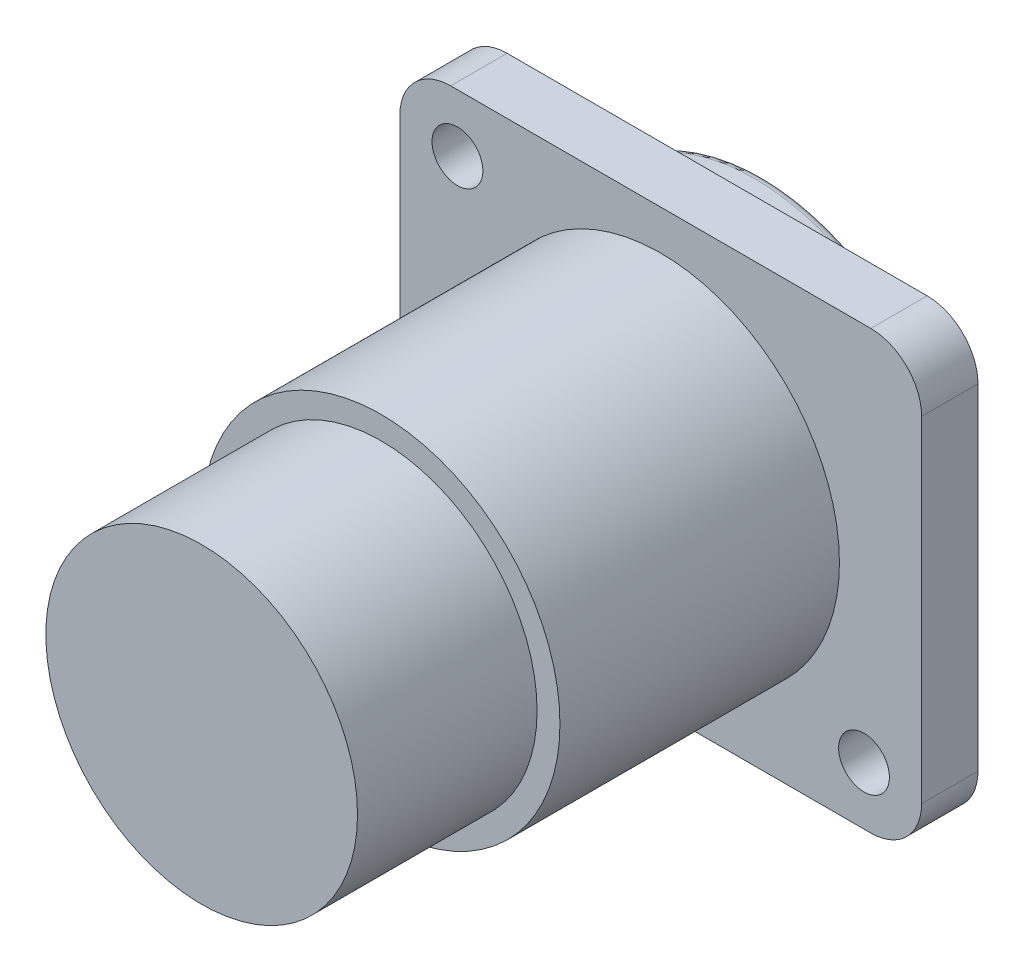
ISO-10303-21;
HEADER;
FILE_DESCRIPTION(('STEP AP214'),'2;1');
FILE_NAME('part.step','',(''),(''),'','','');
FILE_SCHEMA(('AUTOMOTIVE_DESIGN { 1 0 10303 214 1 1 1 1 }'));
ENDSEC;
DATA;
#1=APPLICATION_CONTEXT('core data for automotive mechanical design processes');
#2=APPLICATION_PROTOCOL_DEFINITION('international standard','automotive_design',2000,#1);
#3=PRODUCT_CONTEXT('',#1,'mechanical');
#4=PRODUCT('Part','Part','',(#3));
#5=PRODUCT_RELATED_PRODUCT_CATEGORY('part','',(#4));
#6=PRODUCT_DEFINITION_FORMATION('','',#4);
#7=PRODUCT_DEFINITION_CONTEXT('part definition',#1,'design');
#8=PRODUCT_DEFINITION('design','',#6,#7);
#9=PRODUCT_DEFINITION_SHAPE('','',#8);
#10=(LENGTH_UNIT() NAMED_UNIT(*) SI_UNIT(.MILLI.,.METRE.));
#11=(NAMED_UNIT(*) PLANE_ANGLE_UNIT() SI_UNIT($,.RADIAN.));
#12=(NAMED_UNIT(*) SI_UNIT($,.STERADIAN.) SOLID_ANGLE_UNIT());
#13=UNCERTAINTY_MEASURE_WITH_UNIT(LENGTH_MEASURE(1.E-05),#10,'distance_accuracy_value','');
#14=(GEOMETRIC_REPRESENTATION_CONTEXT(3) GLOBAL_UNCERTAINTY_ASSIGNED_CONTEXT((#13)) GLOBAL_UNIT_ASSIGNED_CONTEXT((#10,
#11,#12)) REPRESENTATION_CONTEXT('',''));
#15=CARTESIAN_POINT('',(0.,0.,0.));
#16=DIRECTION('',(0.,0.,1.));
#17=DIRECTION('',(1.,0.,0.));
#18=AXIS2_PLACEMENT_3D('',#15,#16,#17);
#19=CARTESIAN_POINT('',(0.,0.,2.7));
#20=DIRECTION('',(0.,0.,-1.));
#21=DIRECTION('',(-1.,0.,0.));
#22=AXIS2_PLACEMENT_3D('',#19,#20,#21);
#23=CYLINDRICAL_SURFACE('',#22,11.6);
#24=CARTESIAN_POINT('',(0.,0.,0.5));
#25=DIRECTION('',(0.,0.,1.));
#26=DIRECTION('',(1.,0.,0.));
#27=AXIS2_PLACEMENT_3D('',#24,#25,#26);
#28=CIRCLE('',#27,11.6);
#29=CARTESIAN_POINT('',(-11.6,0.,0.5));
#30=VERTEX_POINT('',#29);
#31=EDGE_CURVE('E146',#30,#30,#28,.T.);
#32=CARTESIAN_POINT('',(0.,0.,2.7));
#33=DIRECTION('',(0.,0.,1.));
#34=DIRECTION('',(1.,0.,0.));
#35=AXIS2_PLACEMENT_3D('',#32,#33,#34);
#36=CIRCLE('',#35,11.6);
#37=CARTESIAN_POINT('',(-11.6,0.,2.7));
#38=VERTEX_POINT('',#37);
#39=EDGE_CURVE('E143',#38,#38,#36,.T.);
#40=CARTESIAN_POINT('',(-11.6,0.,0.5));
#41=CARTESIAN_POINT('',(-11.6,0.,0.522916666666667));
#42=CARTESIAN_POINT('',(-11.6,0.,0.545833333333334));
#43=CARTESIAN_POINT('',(-11.6,0.,0.591666666666667));
#44=CARTESIAN_POINT('',(-11.6,0.,0.614583333333333));
#45=CARTESIAN_POINT('',(-11.6,0.,0.660416666666667));
#46=CARTESIAN_POINT('',(-11.6,0.,0.683333333333333));
#47=CARTESIAN_POINT('',(-11.6,0.,0.729166666666667));
#48=CARTESIAN_POINT('',(-11.6,0.,0.752083333333333));
#49=CARTESIAN_POINT('',(-11.6,0.,0.797916666666666));
#50=CARTESIAN_POINT('',(-11.6,0.,0.820833333333333));
#51=CARTESIAN_POINT('',(-11.6,0.,0.866666666666666));
#52=CARTESIAN_POINT('',(-11.6,0.,0.889583333333333));
#53=CARTESIAN_POINT('',(-11.6,0.,0.935416666666667));
#54=CARTESIAN_POINT('',(-11.6,0.,0.958333333333333));
#55=CARTESIAN_POINT('',(-11.6,0.,1.00416666666667));
#56=CARTESIAN_POINT('',(-11.6,0.,1.02708333333333));
#57=CARTESIAN_POINT('',(-11.6,0.,1.07291666666667));
#58=CARTESIAN_POINT('',(-11.6,0.,1.09583333333333));
#59=CARTESIAN_POINT('',(-11.6,0.,1.14166666666667));
#60=CARTESIAN_POINT('',(-11.6,0.,1.16458333333333));
#61=CARTESIAN_POINT('',(-11.6,0.,1.21041666666667));
#62=CARTESIAN_POINT('',(-11.6,0.,1.23333333333333));
#63=CARTESIAN_POINT('',(-11.6,0.,1.27916666666667));
#64=CARTESIAN_POINT('',(-11.6,0.,1.30208333333333));
#65=CARTESIAN_POINT('',(-11.6,0.,1.34791666666667));
#66=CARTESIAN_POINT('',(-11.6,0.,1.37083333333333));
#67=CARTESIAN_POINT('',(-11.6,0.,1.41666666666667));
#68=CARTESIAN_POINT('',(-11.6,0.,1.43958333333333));
#69=CARTESIAN_POINT('',(-11.6,0.,1.48541666666667));
#70=CARTESIAN_POINT('',(-11.6,0.,1.50833333333333));
#71=CARTESIAN_POINT('',(-11.6,0.,1.55416666666667));
#72=CARTESIAN_POINT('',(-11.6,0.,1.57708333333333));
#73=CARTESIAN_POINT('',(-11.6,0.,1.62291666666667));
#74=CARTESIAN_POINT('',(-11.6,0.,1.64583333333333));
#75=CARTESIAN_POINT('',(-11.6,0.,1.69166666666667));
#76=CARTESIAN_POINT('',(-11.6,0.,1.71458333333333));
#77=CARTESIAN_POINT('',(-11.6,0.,1.76041666666667));
#78=CARTESIAN_POINT('',(-11.6,0.,1.78333333333333));
#79=CARTESIAN_POINT('',(-11.6,0.,1.82916666666667));
#80=CARTESIAN_POINT('',(-11.6,0.,1.85208333333333));
#81=CARTESIAN_POINT('',(-11.6,0.,1.89791666666667));
#82=CARTESIAN_POINT('',(-11.6,0.,1.92083333333333));
#83=CARTESIAN_POINT('',(-11.6,0.,1.96666666666667));
#84=CARTESIAN_POINT('',(-11.6,0.,1.98958333333333));
#85=CARTESIAN_POINT('',(-11.6,0.,2.03541666666667));
#86=CARTESIAN_POINT('',(-11.6,0.,2.05833333333333));
#87=CARTESIAN_POINT('',(-11.6,0.,2.10416666666667));
#88=CARTESIAN_POINT('',(-11.6,0.,2.12708333333333));
#89=CARTESIAN_POINT('',(-11.6,0.,2.17291666666667));
#90=CARTESIAN_POINT('',(-11.6,0.,2.19583333333333));
#91=CARTESIAN_POINT('',(-11.6,0.,2.24166666666667));
#92=CARTESIAN_POINT('',(-11.6,0.,2.26458333333333));
#93=CARTESIAN_POINT('',(-11.6,0.,2.31041666666667));
#94=CARTESIAN_POINT('',(-11.6,0.,2.33333333333333));
#95=CARTESIAN_POINT('',(-11.6,0.,2.37916666666667));
#96=CARTESIAN_POINT('',(-11.6,0.,2.40208333333333));
#97=CARTESIAN_POINT('',(-11.6,0.,2.44791666666667));
#98=CARTESIAN_POINT('',(-11.6,0.,2.47083333333333));
#99=CARTESIAN_POINT('',(-11.6,0.,2.51666666666667));
#100=CARTESIAN_POINT('',(-11.6,0.,2.53958333333333));
#101=CARTESIAN_POINT('',(-11.6,0.,2.58541666666667));
#102=CARTESIAN_POINT('',(-11.6,0.,2.60833333333333));
#103=CARTESIAN_POINT('',(-11.6,0.,2.65416666666667));
#104=CARTESIAN_POINT('',(-11.6,0.,2.67708333333333));
#105=CARTESIAN_POINT('',(-11.6,0.,2.7));
#106=B_SPLINE_CURVE_WITH_KNOTS('',3,(#40,#41,#42,#43,#44,#45,#46,#47,#48,#49,#50,#51,#52,#53,
#54,#55,#56,#57,#58,#59,#60,#61,#62,#63,#64,#65,#66,#67,#68,#69,#70,#71,#72,#73,#74,#75,#76,#77,
#78,#79,#80,#81,#82,#83,#84,#85,#86,#87,#88,#89,#90,#91,#92,#93,#94,#95,#96,#97,#98,#99,#100,
#101,#102,#103,#104,#105),.UNSPECIFIED.,.F.,.F.,(4,2,2,2,2,2,2,2,2,2,2,2,2,2,2,2,2,2,2,2,2,2,2,
2,2,2,2,2,2,2,2,2,4),(0.,0.0687500000000002,0.1375,0.20625,0.275,0.34375,0.4125,0.48125,0.55,
0.61875,0.6875,0.75625,0.825,0.89375,0.9625,1.03125,1.1,1.16875,1.2375,1.30625,1.375,1.44375,
1.5125,1.58125,1.65,1.71875,1.7875,1.85625,1.925,1.99375,2.0625,2.13125,2.2),.UNSPECIFIED.);
#107=EDGE_CURVE('BSEAM39',#30,#38,#106,.T.);
#108=ORIENTED_EDGE('',*,*,#31,.T.);
#109=ORIENTED_EDGE('',*,*,#39,.F.);
#110=ORIENTED_EDGE('',*,*,#107,.T.);
#111=ORIENTED_EDGE('',*,*,#107,.F.);
#112=EDGE_LOOP('',(#108,#110,#109,#111));
#113=FACE_BOUND('',#112,.T.);
#114=ADVANCED_FACE('F39',(#113),#23,.T.);
#115=CARTESIAN_POINT('',(0.,0.,0.));
#116=DIRECTION('',(0.,0.,1.));
#117=DIRECTION('',(1.,0.,0.));
#118=AXIS2_PLACEMENT_3D('',#115,#116,#117);
#119=PLANE('',#118);
#120=CARTESIAN_POINT('',(0.,0.,0.));
#121=DIRECTION('',(0.,0.,1.));
#122=DIRECTION('',(1.,0.,0.));
#123=AXIS2_PLACEMENT_3D('',#120,#121,#122);
#124=CIRCLE('',#123,11.1);
#125=CARTESIAN_POINT('',(11.1,0.,0.));
#126=VERTEX_POINT('',#125);
#127=EDGE_CURVE('E150',#126,#126,#124,.F.);
#128=ORIENTED_EDGE('',*,*,#127,.T.);
#129=EDGE_LOOP('',(#128));
#130=FACE_BOUND('',#129,.T.);
#131=ADVANCED_FACE('F228',(#130),#119,.F.);
#132=CARTESIAN_POINT('',(0.,0.,0.5));
#133=DIRECTION('',(0.,0.,1.));
#134=DIRECTION('',(1.,0.,0.));
#135=AXIS2_PLACEMENT_3D('',#132,#133,#134);
#136=TOROIDAL_SURFACE('',#135,11.1,0.5);
#137=ORIENTED_EDGE('',*,*,#127,.F.);
#138=EDGE_LOOP('',(#137));
#139=FACE_BOUND('',#138,.T.);
#140=ORIENTED_EDGE('',*,*,#31,.F.);
#141=EDGE_LOOP('',(#140));
#142=FACE_BOUND('',#141,.T.);
#143=ADVANCED_FACE('F234',(#139,#142),#136,.T.);
#144=CARTESIAN_POINT('',(15.4,-12.9,6.03));
#145=DIRECTION('',(-1.,0.,0.));
#146=DIRECTION('',(0.,0.,1.));
#147=AXIS2_PLACEMENT_3D('',#144,#145,#146);
#148=PLANE('',#147);
#149=DIRECTION('',(0.,1.,0.));
#150=VECTOR('',#149,1.);
#151=CARTESIAN_POINT('',(15.4,-12.9,2.7));
#152=LINE('',#151,#150);
#153=CARTESIAN_POINT('',(15.4,-9.9,2.7));
#154=VERTEX_POINT('',#153);
#155=CARTESIAN_POINT('',(15.4,9.89999999999999,2.7));
#156=VERTEX_POINT('',#155);
#157=EDGE_CURVE('E132',#154,#156,#152,.T.);
#158=ORIENTED_EDGE('',*,*,#157,.T.);
#159=DIRECTION('',(0.,0.,-1.));
#160=VECTOR('',#159,1.);
#161=CARTESIAN_POINT('',(15.4,9.9,6.03));
#162=LINE('',#161,#160);
#163=CARTESIAN_POINT('',(15.4,9.89999999999999,6.03));
#164=VERTEX_POINT('',#163);
#165=EDGE_CURVE('E110',#156,#164,#162,.F.);
#166=ORIENTED_EDGE('',*,*,#165,.T.);
#167=DIRECTION('',(0.,1.,0.));
#168=VECTOR('',#167,1.);
#169=CARTESIAN_POINT('',(15.4,-12.9,6.03));
#170=LINE('',#169,#168);
#171=CARTESIAN_POINT('',(15.4,-9.9,6.03));
#172=VERTEX_POINT('',#171);
#173=EDGE_CURVE('E142',#172,#164,#170,.T.);
#174=ORIENTED_EDGE('',*,*,#173,.F.);
#175=DIRECTION('',(0.,0.,-1.));
#176=VECTOR('',#175,1.);
#177=CARTESIAN_POINT('',(15.4,-9.9,6.03));
#178=LINE('',#177,#176);
#179=EDGE_CURVE('E115',#172,#154,#178,.T.);
#180=ORIENTED_EDGE('',*,*,#179,.T.);
#181=EDGE_LOOP('',(#158,#166,#174,#180));
#182=FACE_BOUND('',#181,.T.);
#183=ADVANCED_FACE('F241',(#182),#148,.F.);
#184=CARTESIAN_POINT('',(-15.4,12.9,6.03));
#185=DIRECTION('',(0.,-1.,0.));
#186=DIRECTION('',(0.,0.,-1.));
#187=AXIS2_PLACEMENT_3D('',#184,#185,#186);
#188=PLANE('',#187);
#189=DIRECTION('',(-1.,0.,0.));
#190=VECTOR('',#189,1.);
#191=CARTESIAN_POINT('',(-15.4,12.9,6.03));
#192=LINE('',#191,#190);
#193=CARTESIAN_POINT('',(12.4,12.9,6.03));
#194=VERTEX_POINT('',#193);
#195=CARTESIAN_POINT('',(-12.4,12.9,6.03));
#196=VERTEX_POINT('',#195);
#197=EDGE_CURVE('E125',#194,#196,#192,.T.);
#198=ORIENTED_EDGE('',*,*,#197,.F.);
#199=DIRECTION('',(0.,0.,-1.));
#200=VECTOR('',#199,1.);
#201=CARTESIAN_POINT('',(12.4,12.9,6.03));
#202=LINE('',#201,#200);
#203=CARTESIAN_POINT('',(12.4,12.9,2.7));
#204=VERTEX_POINT('',#203);
#205=EDGE_CURVE('E109',#194,#204,#202,.T.);
#206=ORIENTED_EDGE('',*,*,#205,.T.);
#207=DIRECTION('',(-1.,0.,0.));
#208=VECTOR('',#207,1.);
#209=CARTESIAN_POINT('',(-15.4,12.9,2.7));
#210=LINE('',#209,#208);
#211=CARTESIAN_POINT('',(-12.4,12.9,2.7));
#212=VERTEX_POINT('',#211);
#213=EDGE_CURVE('E122',#204,#212,#210,.T.);
#214=ORIENTED_EDGE('',*,*,#213,.T.);
#215=DIRECTION('',(0.,0.,-1.));
#216=VECTOR('',#215,1.);
#217=CARTESIAN_POINT('',(-12.4,12.9,6.03));
#218=LINE('',#217,#216);
#219=EDGE_CURVE('E127',#212,#196,#218,.F.);
#220=ORIENTED_EDGE('',*,*,#219,.T.);
#221=EDGE_LOOP('',(#198,#206,#214,#220));
#222=FACE_BOUND('',#221,.T.);
#223=ADVANCED_FACE('F121',(#222),#188,.F.);
#224=CARTESIAN_POINT('',(-15.4,-12.9,6.03));
#225=DIRECTION('',(1.,0.,0.));
#226=DIRECTION('',(0.,0.,-1.));
#227=AXIS2_PLACEMENT_3D('',#224,#225,#226);
#228=PLANE('',#227);
#229=DIRECTION('',(0.,-1.,0.));
#230=VECTOR('',#229,1.);
#231=CARTESIAN_POINT('',(-15.4,-12.9,6.03));
#232=LINE('',#231,#230);
#233=CARTESIAN_POINT('',(-15.4,9.89999999999999,6.03));
#234=VERTEX_POINT('',#233);
#235=CARTESIAN_POINT('',(-15.4,-9.9,6.03));
#236=VERTEX_POINT('',#235);
#237=EDGE_CURVE('E179',#234,#236,#232,.T.);
#238=ORIENTED_EDGE('',*,*,#237,.F.);
#239=DIRECTION('',(0.,0.,-1.));
#240=VECTOR('',#239,1.);
#241=CARTESIAN_POINT('',(-15.4,9.9,6.03));
#242=LINE('',#241,#240);
#243=CARTESIAN_POINT('',(-15.4,9.89999999999999,2.7));
#244=VERTEX_POINT('',#243);
#245=EDGE_CURVE('E172',#234,#244,#242,.T.);
#246=ORIENTED_EDGE('',*,*,#245,.T.);
#247=DIRECTION('',(0.,-1.,0.));
#248=VECTOR('',#247,1.);
#249=CARTESIAN_POINT('',(-15.4,-12.9,2.7));
#250=LINE('',#249,#248);
#251=CARTESIAN_POINT('',(-15.4,-9.9,2.7));
#252=VERTEX_POINT('',#251);
#253=EDGE_CURVE('E131',#244,#252,#250,.T.);
#254=ORIENTED_EDGE('',*,*,#253,.T.);
#255=DIRECTION('',(0.,0.,-1.));
#256=VECTOR('',#255,1.);
#257=CARTESIAN_POINT('',(-15.4,-9.9,6.03));
#258=LINE('',#257,#256);
#259=EDGE_CURVE('E170',#252,#236,#258,.F.);
#260=ORIENTED_EDGE('',*,*,#259,.T.);
#261=EDGE_LOOP('',(#238,#246,#254,#260));
#262=FACE_BOUND('',#261,.T.);
#263=ADVANCED_FACE('F177',(#262),#228,.F.);
#264=CARTESIAN_POINT('',(-15.4,-12.9,6.03));
#265=DIRECTION('',(0.,1.,0.));
#266=DIRECTION('',(0.,0.,1.));
#267=AXIS2_PLACEMENT_3D('',#264,#265,#266);
#268=PLANE('',#267);
#269=DIRECTION('',(1.,0.,0.));
#270=VECTOR('',#269,1.);
#271=CARTESIAN_POINT('',(-15.4,-12.9,6.03));
#272=LINE('',#271,#270);
#273=CARTESIAN_POINT('',(-12.4,-12.9,6.03));
#274=VERTEX_POINT('',#273);
#275=CARTESIAN_POINT('',(12.4,-12.9,6.03));
#276=VERTEX_POINT('',#275);
#277=EDGE_CURVE('E147',#274,#276,#272,.T.);
#278=ORIENTED_EDGE('',*,*,#277,.F.);
#279=DIRECTION('',(0.,0.,-1.));
#280=VECTOR('',#279,1.);
#281=CARTESIAN_POINT('',(-12.4,-12.9,6.03));
#282=LINE('',#281,#280);
#283=CARTESIAN_POINT('',(-12.4,-12.9,2.7));
#284=VERTEX_POINT('',#283);
#285=EDGE_CURVE('E11',#274,#284,#282,.T.);
#286=ORIENTED_EDGE('',*,*,#285,.T.);
#287=DIRECTION('',(1.,0.,0.));
#288=VECTOR('',#287,1.);
#289=CARTESIAN_POINT('',(-15.4,-12.9,2.7));
#290=LINE('',#289,#288);
#291=CARTESIAN_POINT('',(12.4,-12.9,2.7));
#292=VERTEX_POINT('',#291);
#293=EDGE_CURVE('E135',#284,#292,#290,.T.);
#294=ORIENTED_EDGE('',*,*,#293,.T.);
#295=DIRECTION('',(0.,0.,-1.));
#296=VECTOR('',#295,1.);
#297=CARTESIAN_POINT('',(12.4,-12.9,6.03));
#298=LINE('',#297,#296);
#299=EDGE_CURVE('E47',#292,#276,#298,.F.);
#300=ORIENTED_EDGE('',*,*,#299,.T.);
#301=EDGE_LOOP('',(#278,#286,#294,#300));
#302=FACE_BOUND('',#301,.T.);
#303=ADVANCED_FACE('F186',(#302),#268,.F.);
#304=CARTESIAN_POINT('',(0.,0.,6.03));
#305=DIRECTION('',(0.,0.,-1.));
#306=DIRECTION('',(-1.,0.,0.));
#307=AXIS2_PLACEMENT_3D('',#304,#305,#306);
#308=PLANE('',#307);
#309=CARTESIAN_POINT('',(12.,-9.5,6.03));
#310=DIRECTION('',(0.,0.,-1.));
#311=DIRECTION('',(-1.,0.,0.));
#312=AXIS2_PLACEMENT_3D('',#309,#310,#311);
#313=CIRCLE('',#312,1.5);
#314=CARTESIAN_POINT('',(10.5,-9.5,6.03));
#315=VERTEX_POINT('',#314);
#316=EDGE_CURVE('E202',#315,#315,#313,.T.);
#317=ORIENTED_EDGE('',*,*,#316,.T.);
#318=EDGE_LOOP('',(#317));
#319=FACE_BOUND('',#318,.T.);
#320=CARTESIAN_POINT('',(-12.,9.5,6.03));
#321=DIRECTION('',(0.,0.,-1.));
#322=DIRECTION('',(-1.,0.,0.));
#323=AXIS2_PLACEMENT_3D('',#320,#321,#322);
#324=CIRCLE('',#323,1.5);
#325=CARTESIAN_POINT('',(-13.5,9.5,6.03));
#326=VERTEX_POINT('',#325);
#327=EDGE_CURVE('E205',#326,#326,#324,.T.);
#328=ORIENTED_EDGE('',*,*,#327,.T.);
#329=EDGE_LOOP('',(#328));
#330=FACE_BOUND('',#329,.T.);
#331=CARTESIAN_POINT('',(0.,0.,6.03));
#332=DIRECTION('',(0.,0.,1.));
#333=DIRECTION('',(1.,0.,0.));
#334=AXIS2_PLACEMENT_3D('',#331,#332,#333);
#335=CIRCLE('',#334,10.55);
#336=CARTESIAN_POINT('',(10.55,0.,6.03));
#337=VERTEX_POINT('',#336);
#338=EDGE_CURVE('E153',#337,#337,#335,.T.);
#339=ORIENTED_EDGE('',*,*,#338,.F.);
#340=EDGE_LOOP('',(#339));
#341=FACE_BOUND('',#340,.T.);
#342=ORIENTED_EDGE('',*,*,#173,.T.);
#343=CARTESIAN_POINT('',(12.4,9.9,6.03));
#344=DIRECTION('',(0.,0.,-1.));
#345=DIRECTION('',(-1.,0.,0.));
#346=AXIS2_PLACEMENT_3D('',#343,#344,#345);
#347=CIRCLE('',#346,3.);
#348=EDGE_CURVE('E168',#164,#194,#347,.F.);
#349=ORIENTED_EDGE('',*,*,#348,.T.);
#350=ORIENTED_EDGE('',*,*,#197,.T.);
#351=CARTESIAN_POINT('',(-12.4,9.9,6.03));
#352=DIRECTION('',(0.,0.,-1.));
#353=DIRECTION('',(-1.,0.,0.));
#354=AXIS2_PLACEMENT_3D('',#351,#352,#353);
#355=CIRCLE('',#354,3.);
#356=EDGE_CURVE('E166',#196,#234,#355,.F.);
#357=ORIENTED_EDGE('',*,*,#356,.T.);
#358=ORIENTED_EDGE('',*,*,#237,.T.);
#359=CARTESIAN_POINT('',(-12.4,-9.9,6.03));
#360=DIRECTION('',(0.,0.,-1.));
#361=DIRECTION('',(-1.,0.,0.));
#362=AXIS2_PLACEMENT_3D('',#359,#360,#361);
#363=CIRCLE('',#362,3.);
#364=EDGE_CURVE('E60',#236,#274,#363,.F.);
#365=ORIENTED_EDGE('',*,*,#364,.T.);
#366=ORIENTED_EDGE('',*,*,#277,.T.);
#367=CARTESIAN_POINT('',(12.4,-9.9,6.03));
#368=DIRECTION('',(0.,0.,-1.));
#369=DIRECTION('',(-1.,0.,0.));
#370=AXIS2_PLACEMENT_3D('',#367,#368,#369);
#371=CIRCLE('',#370,3.);
#372=EDGE_CURVE('E163',#276,#172,#371,.F.);
#373=ORIENTED_EDGE('',*,*,#372,.T.);
#374=EDGE_LOOP('',(#342,#349,#350,#357,#358,#365,#366,#373));
#375=FACE_BOUND('',#374,.T.);
#376=ADVANCED_FACE('F221',(#319,#330,#341,#375),#308,.F.);
#377=CARTESIAN_POINT('',(0.,0.,2.7));
#378=DIRECTION('',(0.,0.,-1.));
#379=DIRECTION('',(-1.,0.,0.));
#380=AXIS2_PLACEMENT_3D('',#377,#378,#379);
#381=PLANE('',#380);
#382=CARTESIAN_POINT('',(12.,-9.5,2.7));
#383=DIRECTION('',(0.,0.,-1.));
#384=DIRECTION('',(-1.,0.,0.));
#385=AXIS2_PLACEMENT_3D('',#382,#383,#384);
#386=CIRCLE('',#385,1.5);
#387=CARTESIAN_POINT('',(10.5,-9.5,2.7));
#388=VERTEX_POINT('',#387);
#389=EDGE_CURVE('E208',#388,#388,#386,.T.);
#390=ORIENTED_EDGE('',*,*,#389,.F.);
#391=EDGE_LOOP('',(#390));
#392=FACE_BOUND('',#391,.T.);
#393=CARTESIAN_POINT('',(-12.,9.5,2.7));
#394=DIRECTION('',(0.,0.,-1.));
#395=DIRECTION('',(-1.,0.,0.));
#396=AXIS2_PLACEMENT_3D('',#393,#394,#395);
#397=CIRCLE('',#396,1.5);
#398=CARTESIAN_POINT('',(-13.5,9.5,2.7));
#399=VERTEX_POINT('',#398);
#400=EDGE_CURVE('E209',#399,#399,#397,.T.);
#401=ORIENTED_EDGE('',*,*,#400,.F.);
#402=EDGE_LOOP('',(#401));
#403=FACE_BOUND('',#402,.T.);
#404=ORIENTED_EDGE('',*,*,#39,.T.);
#405=EDGE_LOOP('',(#404));
#406=FACE_BOUND('',#405,.T.);
#407=ORIENTED_EDGE('',*,*,#213,.F.);
#408=CARTESIAN_POINT('',(12.4,9.9,2.7));
#409=DIRECTION('',(0.,0.,-1.));
#410=DIRECTION('',(-1.,0.,0.));
#411=AXIS2_PLACEMENT_3D('',#408,#409,#410);
#412=CIRCLE('',#411,3.);
#413=EDGE_CURVE('E105',#204,#156,#412,.T.);
#414=ORIENTED_EDGE('',*,*,#413,.T.);
#415=ORIENTED_EDGE('',*,*,#157,.F.);
#416=CARTESIAN_POINT('',(12.4,-9.9,2.7));
#417=DIRECTION('',(0.,0.,-1.));
#418=DIRECTION('',(-1.,0.,0.));
#419=AXIS2_PLACEMENT_3D('',#416,#417,#418);
#420=CIRCLE('',#419,3.);
#421=EDGE_CURVE('E126',#154,#292,#420,.T.);
#422=ORIENTED_EDGE('',*,*,#421,.T.);
#423=ORIENTED_EDGE('',*,*,#293,.F.);
#424=CARTESIAN_POINT('',(-12.4,-9.9,2.7));
#425=DIRECTION('',(0.,0.,-1.));
#426=DIRECTION('',(-1.,0.,0.));
#427=AXIS2_PLACEMENT_3D('',#424,#425,#426);
#428=CIRCLE('',#427,3.);
#429=EDGE_CURVE('E157',#284,#252,#428,.T.);
#430=ORIENTED_EDGE('',*,*,#429,.T.);
#431=ORIENTED_EDGE('',*,*,#253,.F.);
#432=CARTESIAN_POINT('',(-12.4,9.9,2.7));
#433=DIRECTION('',(0.,0.,-1.));
#434=DIRECTION('',(-1.,0.,0.));
#435=AXIS2_PLACEMENT_3D('',#432,#433,#434);
#436=CIRCLE('',#435,3.);
#437=EDGE_CURVE('E116',#244,#212,#436,.T.);
#438=ORIENTED_EDGE('',*,*,#437,.T.);
#439=EDGE_LOOP('',(#407,#414,#415,#422,#423,#430,#431,#438));
#440=FACE_BOUND('',#439,.T.);
#441=ADVANCED_FACE('F129',(#392,#403,#406,#440),#381,.T.);
#442=CARTESIAN_POINT('',(0.,0.,22.53));
#443=DIRECTION('',(0.,0.,-1.));
#444=DIRECTION('',(-1.,0.,0.));
#445=AXIS2_PLACEMENT_3D('',#442,#443,#444);
#446=CYLINDRICAL_SURFACE('',#445,10.55);
#447=CARTESIAN_POINT('',(0.,0.,22.53));
#448=DIRECTION('',(0.,0.,1.));
#449=DIRECTION('',(1.,0.,0.));
#450=AXIS2_PLACEMENT_3D('',#447,#448,#449);
#451=CIRCLE('',#450,10.55);
#452=CARTESIAN_POINT('',(10.55,0.,22.53));
#453=VERTEX_POINT('',#452);
#454=EDGE_CURVE('E137',#453,#453,#451,.T.);
#455=ORIENTED_EDGE('',*,*,#454,.F.);
#456=EDGE_LOOP('',(#455));
#457=FACE_BOUND('',#456,.T.);
#458=ORIENTED_EDGE('',*,*,#338,.T.);
#459=EDGE_LOOP('',(#458));
#460=FACE_BOUND('',#459,.T.);
#461=ADVANCED_FACE('F220',(#457,#460),#446,.T.);
#462=CARTESIAN_POINT('',(0.,0.,22.53));
#463=DIRECTION('',(0.,0.,1.));
#464=DIRECTION('',(1.,0.,0.));
#465=AXIS2_PLACEMENT_3D('',#462,#463,#464);
#466=PLANE('',#465);
#467=CARTESIAN_POINT('',(0.,0.,22.53));
#468=DIRECTION('',(0.,0.,1.));
#469=DIRECTION('',(1.,0.,0.));
#470=AXIS2_PLACEMENT_3D('',#467,#468,#469);
#471=CIRCLE('',#470,9.2);
#472=CARTESIAN_POINT('',(9.2,0.,22.53));
#473=VERTEX_POINT('',#472);
#474=EDGE_CURVE('E154',#473,#473,#471,.T.);
#475=ORIENTED_EDGE('',*,*,#474,.F.);
#476=EDGE_LOOP('',(#475));
#477=FACE_BOUND('',#476,.T.);
#478=ORIENTED_EDGE('',*,*,#454,.T.);
#479=EDGE_LOOP('',(#478));
#480=FACE_BOUND('',#479,.T.);
#481=ADVANCED_FACE('F273',(#477,#480),#466,.T.);
#482=CARTESIAN_POINT('',(0.,0.,33.13));
#483=DIRECTION('',(0.,0.,-1.));
#484=DIRECTION('',(-1.,0.,0.));
#485=AXIS2_PLACEMENT_3D('',#482,#483,#484);
#486=CYLINDRICAL_SURFACE('',#485,9.2);
#487=CARTESIAN_POINT('',(0.,0.,33.13));
#488=DIRECTION('',(0.,0.,1.));
#489=DIRECTION('',(1.,0.,0.));
#490=AXIS2_PLACEMENT_3D('',#487,#488,#489);
#491=CIRCLE('',#490,9.2);
#492=CARTESIAN_POINT('',(9.2,0.,33.13));
#493=VERTEX_POINT('',#492);
#494=EDGE_CURVE('E197',#493,#493,#491,.T.);
#495=ORIENTED_EDGE('',*,*,#494,.F.);
#496=EDGE_LOOP('',(#495));
#497=FACE_BOUND('',#496,.T.);
#498=ORIENTED_EDGE('',*,*,#474,.T.);
#499=EDGE_LOOP('',(#498));
#500=FACE_BOUND('',#499,.T.);
#501=ADVANCED_FACE('F277',(#497,#500),#486,.T.);
#502=CARTESIAN_POINT('',(0.,0.,33.13));
#503=DIRECTION('',(0.,0.,1.));
#504=DIRECTION('',(1.,0.,0.));
#505=AXIS2_PLACEMENT_3D('',#502,#503,#504);
#506=PLANE('',#505);
#507=ORIENTED_EDGE('',*,*,#494,.T.);
#508=EDGE_LOOP('',(#507));
#509=FACE_BOUND('',#508,.T.);
#510=ADVANCED_FACE('F281',(#509),#506,.T.);
#511=CARTESIAN_POINT('',(-12.,9.5,13.3));
#512=DIRECTION('',(0.,0.,-1.));
#513=DIRECTION('',(-1.,0.,0.));
#514=AXIS2_PLACEMENT_3D('',#511,#512,#513);
#515=CYLINDRICAL_SURFACE('',#514,1.5);
#516=ORIENTED_EDGE('',*,*,#400,.T.);
#517=EDGE_LOOP('',(#516));
#518=FACE_BOUND('',#517,.T.);
#519=ORIENTED_EDGE('',*,*,#327,.F.);
#520=EDGE_LOOP('',(#519));
#521=FACE_BOUND('',#520,.T.);
#522=ADVANCED_FACE('F285',(#518,#521),#515,.F.);
#523=CARTESIAN_POINT('',(12.,-9.5,13.3));
#524=DIRECTION('',(0.,0.,-1.));
#525=DIRECTION('',(-1.,0.,0.));
#526=AXIS2_PLACEMENT_3D('',#523,#524,#525);
#527=CYLINDRICAL_SURFACE('',#526,1.5);
#528=ORIENTED_EDGE('',*,*,#389,.T.);
#529=EDGE_LOOP('',(#528));
#530=FACE_BOUND('',#529,.T.);
#531=ORIENTED_EDGE('',*,*,#316,.F.);
#532=EDGE_LOOP('',(#531));
#533=FACE_BOUND('',#532,.T.);
#534=ADVANCED_FACE('F215',(#530,#533),#527,.F.);
#535=CARTESIAN_POINT('',(12.4,9.9,6.03));
#536=DIRECTION('',(0.,0.,-1.));
#537=DIRECTION('',(-1.,0.,0.));
#538=AXIS2_PLACEMENT_3D('',#535,#536,#537);
#539=CYLINDRICAL_SURFACE('',#538,3.);
#540=ORIENTED_EDGE('',*,*,#348,.F.);
#541=ORIENTED_EDGE('',*,*,#165,.F.);
#542=ORIENTED_EDGE('',*,*,#413,.F.);
#543=ORIENTED_EDGE('',*,*,#205,.F.);
#544=EDGE_LOOP('',(#540,#541,#542,#543));
#545=FACE_BOUND('',#544,.T.);
#546=ADVANCED_FACE('F108',(#545),#539,.T.);
#547=CARTESIAN_POINT('',(-12.4,9.9,6.03));
#548=DIRECTION('',(0.,0.,-1.));
#549=DIRECTION('',(-1.,0.,0.));
#550=AXIS2_PLACEMENT_3D('',#547,#548,#549);
#551=CYLINDRICAL_SURFACE('',#550,3.);
#552=ORIENTED_EDGE('',*,*,#356,.F.);
#553=ORIENTED_EDGE('',*,*,#219,.F.);
#554=ORIENTED_EDGE('',*,*,#437,.F.);
#555=ORIENTED_EDGE('',*,*,#245,.F.);
#556=EDGE_LOOP('',(#552,#553,#554,#555));
#557=FACE_BOUND('',#556,.T.);
#558=ADVANCED_FACE('F245',(#557),#551,.T.);
#559=CARTESIAN_POINT('',(-12.4,-9.9,6.03));
#560=DIRECTION('',(0.,0.,-1.));
#561=DIRECTION('',(-1.,0.,0.));
#562=AXIS2_PLACEMENT_3D('',#559,#560,#561);
#563=CYLINDRICAL_SURFACE('',#562,3.);
#564=ORIENTED_EDGE('',*,*,#364,.F.);
#565=ORIENTED_EDGE('',*,*,#259,.F.);
#566=ORIENTED_EDGE('',*,*,#429,.F.);
#567=ORIENTED_EDGE('',*,*,#285,.F.);
#568=EDGE_LOOP('',(#564,#565,#566,#567));
#569=FACE_BOUND('',#568,.T.);
#570=ADVANCED_FACE('F185',(#569),#563,.T.);
#571=CARTESIAN_POINT('',(12.4,-9.9,6.03));
#572=DIRECTION('',(0.,0.,-1.));
#573=DIRECTION('',(-1.,0.,0.));
#574=AXIS2_PLACEMENT_3D('',#571,#572,#573);
#575=CYLINDRICAL_SURFACE('',#574,3.);
#576=ORIENTED_EDGE('',*,*,#372,.F.);
#577=ORIENTED_EDGE('',*,*,#299,.F.);
#578=ORIENTED_EDGE('',*,*,#421,.F.);
#579=ORIENTED_EDGE('',*,*,#179,.F.);
#580=EDGE_LOOP('',(#576,#577,#578,#579));
#581=FACE_BOUND('',#580,.T.);
#582=ADVANCED_FACE('F41',(#581),#575,.T.);
#583=CLOSED_SHELL('',(#114,#131,#143,#183,#223,#263,#303,#376,#441,#461,#481,#501,#510,#522,
#534,#546,#558,#570,#582));
#584=MANIFOLD_SOLID_BREP('B2',#583);
#585=ADVANCED_BREP_SHAPE_REPRESENTATION('',(#18,#584),#14);
#586=SHAPE_DEFINITION_REPRESENTATION(#9,#585);
ENDSEC;
END-ISO-10303-21;
